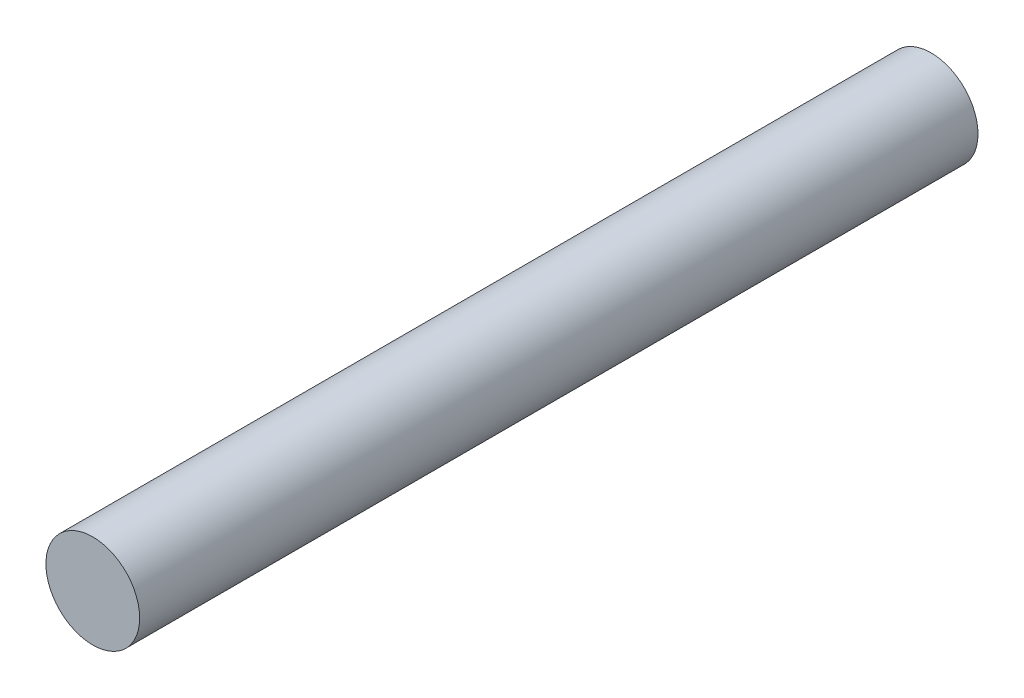
ISO-10303-21;
HEADER;
FILE_DESCRIPTION(('STEP AP214'),'2;1');
FILE_NAME('part.step','',(''),(''),'','','');
FILE_SCHEMA(('AUTOMOTIVE_DESIGN { 1 0 10303 214 1 1 1 1 }'));
ENDSEC;
DATA;
#1=APPLICATION_CONTEXT('core data for automotive mechanical design processes');
#2=APPLICATION_PROTOCOL_DEFINITION('international standard','automotive_design',2000,#1);
#3=PRODUCT_CONTEXT('',#1,'mechanical');
#4=PRODUCT('Part','Part','',(#3));
#5=PRODUCT_RELATED_PRODUCT_CATEGORY('part','',(#4));
#6=PRODUCT_DEFINITION_FORMATION('','',#4);
#7=PRODUCT_DEFINITION_CONTEXT('part definition',#1,'design');
#8=PRODUCT_DEFINITION('design','',#6,#7);
#9=PRODUCT_DEFINITION_SHAPE('','',#8);
#10=(LENGTH_UNIT() NAMED_UNIT(*) SI_UNIT(.MILLI.,.METRE.));
#11=(NAMED_UNIT(*) PLANE_ANGLE_UNIT() SI_UNIT($,.RADIAN.));
#12=(NAMED_UNIT(*) SI_UNIT($,.STERADIAN.) SOLID_ANGLE_UNIT());
#13=UNCERTAINTY_MEASURE_WITH_UNIT(LENGTH_MEASURE(1.E-05),#10,'distance_accuracy_value','');
#14=(GEOMETRIC_REPRESENTATION_CONTEXT(3) GLOBAL_UNCERTAINTY_ASSIGNED_CONTEXT((#13)) GLOBAL_UNIT_ASSIGNED_CONTEXT((#10,
#11,#12)) REPRESENTATION_CONTEXT('',''));
#15=CARTESIAN_POINT('',(0.,0.,0.));
#16=DIRECTION('',(0.,0.,1.));
#17=DIRECTION('',(1.,0.,0.));
#18=AXIS2_PLACEMENT_3D('',#15,#16,#17);
#19=CARTESIAN_POINT('',(0.,0.,161.29));
#20=DIRECTION('',(0.,0.,-1.));
#21=DIRECTION('',(-1.,0.,0.));
#22=AXIS2_PLACEMENT_3D('',#19,#20,#21);
#23=CYLINDRICAL_SURFACE('',#22,9.017);
#24=CARTESIAN_POINT('',(0.,0.,161.29));
#25=DIRECTION('',(0.,0.,1.));
#26=DIRECTION('',(1.,0.,0.));
#27=AXIS2_PLACEMENT_3D('',#24,#25,#26);
#28=CIRCLE('',#27,9.017);
#29=CARTESIAN_POINT('',(9.017,0.,161.29));
#30=VERTEX_POINT('',#29);
#31=EDGE_CURVE('E10',#30,#30,#28,.T.);
#32=ORIENTED_EDGE('',*,*,#31,.F.);
#33=EDGE_LOOP('',(#32));
#34=FACE_BOUND('',#33,.T.);
#35=CARTESIAN_POINT('',(0.,0.,0.));
#36=DIRECTION('',(0.,0.,1.));
#37=DIRECTION('',(1.,0.,0.));
#38=AXIS2_PLACEMENT_3D('',#35,#36,#37);
#39=CIRCLE('',#38,9.017);
#40=CARTESIAN_POINT('',(9.017,0.,0.));
#41=VERTEX_POINT('',#40);
#42=EDGE_CURVE('E40',#41,#41,#39,.T.);
#43=ORIENTED_EDGE('',*,*,#42,.T.);
#44=EDGE_LOOP('',(#43));
#45=FACE_BOUND('',#44,.T.);
#46=ADVANCED_FACE('F37',(#34,#45),#23,.T.);
#47=CARTESIAN_POINT('',(0.,0.,161.29));
#48=DIRECTION('',(0.,0.,1.));
#49=DIRECTION('',(1.,0.,0.));
#50=AXIS2_PLACEMENT_3D('',#47,#48,#49);
#51=PLANE('',#50);
#52=ORIENTED_EDGE('',*,*,#31,.T.);
#53=EDGE_LOOP('',(#52));
#54=FACE_BOUND('',#53,.T.);
#55=ADVANCED_FACE('F54',(#54),#51,.T.);
#56=CARTESIAN_POINT('',(0.,0.,0.));
#57=DIRECTION('',(0.,0.,1.));
#58=DIRECTION('',(1.,0.,0.));
#59=AXIS2_PLACEMENT_3D('',#56,#57,#58);
#60=PLANE('',#59);
#61=ORIENTED_EDGE('',*,*,#42,.F.);
#62=EDGE_LOOP('',(#61));
#63=FACE_BOUND('',#62,.T.);
#64=ADVANCED_FACE('F52',(#63),#60,.F.);
#65=CLOSED_SHELL('',(#46,#55,#64));
#66=MANIFOLD_SOLID_BREP('B2',#65);
#67=ADVANCED_BREP_SHAPE_REPRESENTATION('',(#18,#66),#14);
#68=SHAPE_DEFINITION_REPRESENTATION(#9,#67);
ENDSEC;
END-ISO-10303-21;
